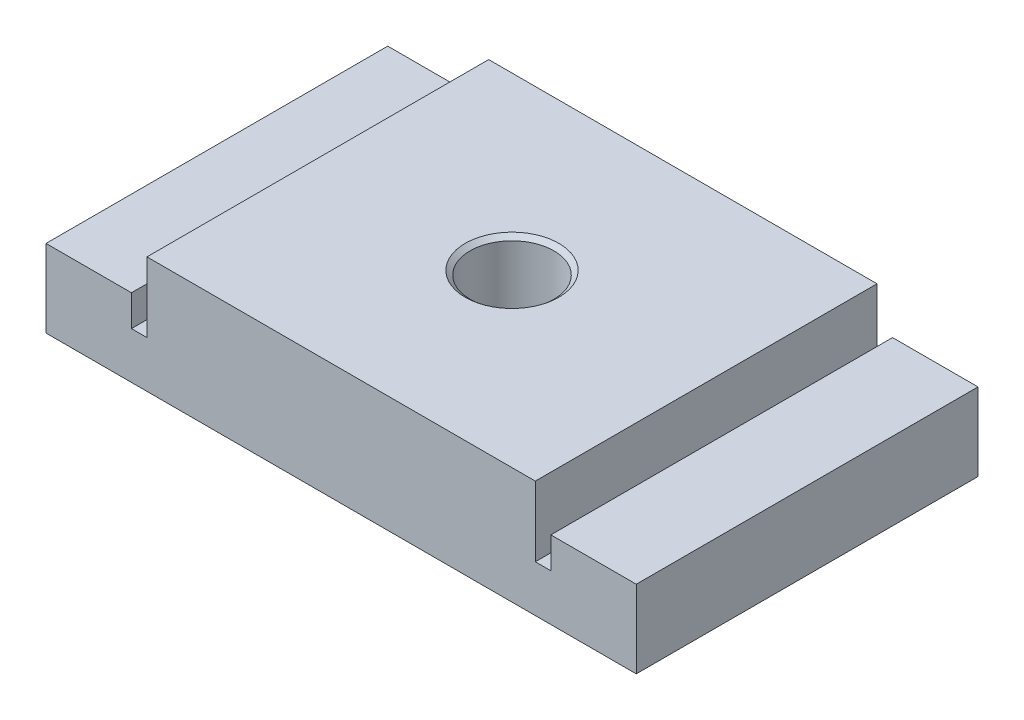
ISO-10303-21;
HEADER;
FILE_DESCRIPTION(('STEP AP214'),'2;1');
FILE_NAME('part.step','',(''),(''),'','','');
FILE_SCHEMA(('AUTOMOTIVE_DESIGN { 1 0 10303 214 1 1 1 1 }'));
ENDSEC;
DATA;
#1=APPLICATION_CONTEXT('core data for automotive mechanical design processes');
#2=APPLICATION_PROTOCOL_DEFINITION('international standard','automotive_design',2000,#1);
#3=PRODUCT_CONTEXT('',#1,'mechanical');
#4=PRODUCT('Part','Part','',(#3));
#5=PRODUCT_RELATED_PRODUCT_CATEGORY('part','',(#4));
#6=PRODUCT_DEFINITION_FORMATION('','',#4);
#7=PRODUCT_DEFINITION_CONTEXT('part definition',#1,'design');
#8=PRODUCT_DEFINITION('design','',#6,#7);
#9=PRODUCT_DEFINITION_SHAPE('','',#8);
#10=(LENGTH_UNIT() NAMED_UNIT(*) SI_UNIT(.MILLI.,.METRE.));
#11=(NAMED_UNIT(*) PLANE_ANGLE_UNIT() SI_UNIT($,.RADIAN.));
#12=(NAMED_UNIT(*) SI_UNIT($,.STERADIAN.) SOLID_ANGLE_UNIT());
#13=UNCERTAINTY_MEASURE_WITH_UNIT(LENGTH_MEASURE(1.E-05),#10,'distance_accuracy_value','');
#14=(GEOMETRIC_REPRESENTATION_CONTEXT(3) GLOBAL_UNCERTAINTY_ASSIGNED_CONTEXT((#13)) GLOBAL_UNIT_ASSIGNED_CONTEXT((#10,
#11,#12)) REPRESENTATION_CONTEXT('',''));
#15=CARTESIAN_POINT('',(0.,0.,0.));
#16=DIRECTION('',(0.,0.,1.));
#17=DIRECTION('',(1.,0.,0.));
#18=AXIS2_PLACEMENT_3D('',#15,#16,#17);
#19=CARTESIAN_POINT('',(-25.,15.,22.));
#20=DIRECTION('',(0.,-1.,0.));
#21=DIRECTION('',(0.,0.,-1.));
#22=AXIS2_PLACEMENT_3D('',#19,#20,#21);
#23=PLANE('',#22);
#24=DIRECTION('',(-1.,0.,0.));
#25=VECTOR('',#24,1.);
#26=CARTESIAN_POINT('',(-25.,15.,-22.));
#27=LINE('',#26,#25);
#28=CARTESIAN_POINT('',(25.,15.,-22.));
#29=VERTEX_POINT('',#28);
#30=CARTESIAN_POINT('',(-25.,15.,-22.));
#31=VERTEX_POINT('',#30);
#32=EDGE_CURVE('E179',#29,#31,#27,.T.);
#33=ORIENTED_EDGE('',*,*,#32,.T.);
#34=DIRECTION('',(0.,0.,-1.));
#35=VECTOR('',#34,1.);
#36=CARTESIAN_POINT('',(-25.,15.,22.));
#37=LINE('',#36,#35);
#38=CARTESIAN_POINT('',(-25.,15.,22.));
#39=VERTEX_POINT('',#38);
#40=EDGE_CURVE('E198',#39,#31,#37,.T.);
#41=ORIENTED_EDGE('',*,*,#40,.F.);
#42=DIRECTION('',(-1.,0.,0.));
#43=VECTOR('',#42,1.);
#44=CARTESIAN_POINT('',(-25.,15.,22.));
#45=LINE('',#44,#43);
#46=CARTESIAN_POINT('',(25.,15.,22.));
#47=VERTEX_POINT('',#46);
#48=EDGE_CURVE('E237',#47,#39,#45,.T.);
#49=ORIENTED_EDGE('',*,*,#48,.F.);
#50=DIRECTION('',(0.,0.,-1.));
#51=VECTOR('',#50,1.);
#52=CARTESIAN_POINT('',(25.,15.,22.));
#53=LINE('',#52,#51);
#54=EDGE_CURVE('E197',#47,#29,#53,.T.);
#55=ORIENTED_EDGE('',*,*,#54,.T.);
#56=EDGE_LOOP('',(#33,#41,#49,#55));
#57=FACE_BOUND('',#56,.T.);
#58=CARTESIAN_POINT('',(0.,15.,0.));
#59=DIRECTION('',(0.,1.,0.));
#60=DIRECTION('',(0.,0.,1.));
#61=AXIS2_PLACEMENT_3D('',#58,#59,#60);
#62=CIRCLE('',#61,6.025);
#63=CARTESIAN_POINT('',(0.,15.,6.025));
#64=VERTEX_POINT('',#63);
#65=EDGE_CURVE('E392',#64,#64,#62,.T.);
#66=ORIENTED_EDGE('',*,*,#65,.F.);
#67=EDGE_LOOP('',(#66));
#68=FACE_BOUND('',#67,.T.);
#69=ADVANCED_FACE('F44',(#57,#68),#23,.F.);
#70=CARTESIAN_POINT('',(-38.,0.,22.));
#71=DIRECTION('',(0.,1.,0.));
#72=DIRECTION('',(0.,0.,1.));
#73=AXIS2_PLACEMENT_3D('',#70,#71,#72);
#74=PLANE('',#73);
#75=CARTESIAN_POINT('',(0.,0.,0.));
#76=DIRECTION('',(0.,1.,0.));
#77=DIRECTION('',(0.,0.,1.));
#78=AXIS2_PLACEMENT_3D('',#75,#76,#77);
#79=CIRCLE('',#78,5.4);
#80=CARTESIAN_POINT('',(0.,0.,5.4));
#81=VERTEX_POINT('',#80);
#82=EDGE_CURVE('E169',#81,#81,#79,.T.);
#83=ORIENTED_EDGE('',*,*,#82,.T.);
#84=EDGE_LOOP('',(#83));
#85=FACE_BOUND('',#84,.T.);
#86=DIRECTION('',(1.,0.,0.));
#87=VECTOR('',#86,1.);
#88=CARTESIAN_POINT('',(-38.,0.,-22.));
#89=LINE('',#88,#87);
#90=CARTESIAN_POINT('',(-38.,0.,-22.));
#91=VERTEX_POINT('',#90);
#92=CARTESIAN_POINT('',(38.,0.,-22.));
#93=VERTEX_POINT('',#92);
#94=EDGE_CURVE('E168',#91,#93,#89,.T.);
#95=ORIENTED_EDGE('',*,*,#94,.T.);
#96=DIRECTION('',(0.,0.,-1.));
#97=VECTOR('',#96,1.);
#98=CARTESIAN_POINT('',(38.,0.,22.));
#99=LINE('',#98,#97);
#100=CARTESIAN_POINT('',(38.,0.,22.));
#101=VERTEX_POINT('',#100);
#102=EDGE_CURVE('E11',#101,#93,#99,.T.);
#103=ORIENTED_EDGE('',*,*,#102,.F.);
#104=DIRECTION('',(1.,0.,0.));
#105=VECTOR('',#104,1.);
#106=CARTESIAN_POINT('',(-38.,0.,22.));
#107=LINE('',#106,#105);
#108=CARTESIAN_POINT('',(-38.,0.,22.));
#109=VERTEX_POINT('',#108);
#110=EDGE_CURVE('E188',#109,#101,#107,.T.);
#111=ORIENTED_EDGE('',*,*,#110,.F.);
#112=DIRECTION('',(0.,0.,-1.));
#113=VECTOR('',#112,1.);
#114=CARTESIAN_POINT('',(-38.,0.,22.));
#115=LINE('',#114,#113);
#116=EDGE_CURVE('E165',#109,#91,#115,.T.);
#117=ORIENTED_EDGE('',*,*,#116,.T.);
#118=EDGE_LOOP('',(#95,#103,#111,#117));
#119=FACE_BOUND('',#118,.T.);
#120=ADVANCED_FACE('F50',(#85,#119),#74,.F.);
#121=CARTESIAN_POINT('',(38.,0.,22.));
#122=DIRECTION('',(-1.,0.,0.));
#123=DIRECTION('',(0.,0.,1.));
#124=AXIS2_PLACEMENT_3D('',#121,#122,#123);
#125=PLANE('',#124);
#126=DIRECTION('',(0.,1.,0.));
#127=VECTOR('',#126,1.);
#128=CARTESIAN_POINT('',(38.,0.,-22.));
#129=LINE('',#128,#127);
#130=CARTESIAN_POINT('',(38.,10.,-22.));
#131=VERTEX_POINT('',#130);
#132=EDGE_CURVE('E170',#93,#131,#129,.T.);
#133=ORIENTED_EDGE('',*,*,#132,.T.);
#134=DIRECTION('',(0.,0.,-1.));
#135=VECTOR('',#134,1.);
#136=CARTESIAN_POINT('',(38.,10.,22.));
#137=LINE('',#136,#135);
#138=CARTESIAN_POINT('',(38.,10.,22.));
#139=VERTEX_POINT('',#138);
#140=EDGE_CURVE('E53',#139,#131,#137,.T.);
#141=ORIENTED_EDGE('',*,*,#140,.F.);
#142=DIRECTION('',(0.,1.,0.));
#143=VECTOR('',#142,1.);
#144=CARTESIAN_POINT('',(38.,0.,22.));
#145=LINE('',#144,#143);
#146=EDGE_CURVE('E120',#101,#139,#145,.T.);
#147=ORIENTED_EDGE('',*,*,#146,.F.);
#148=ORIENTED_EDGE('',*,*,#102,.T.);
#149=EDGE_LOOP('',(#133,#141,#147,#148));
#150=FACE_BOUND('',#149,.T.);
#151=ADVANCED_FACE('F273',(#150),#125,.F.);
#152=CARTESIAN_POINT('',(38.,10.,22.));
#153=DIRECTION('',(0.,-1.,0.));
#154=DIRECTION('',(0.,0.,-1.));
#155=AXIS2_PLACEMENT_3D('',#152,#153,#154);
#156=PLANE('',#155);
#157=DIRECTION('',(-1.,0.,0.));
#158=VECTOR('',#157,1.);
#159=CARTESIAN_POINT('',(38.,10.,-22.));
#160=LINE('',#159,#158);
#161=CARTESIAN_POINT('',(27.,10.,-22.));
#162=VERTEX_POINT('',#161);
#163=EDGE_CURVE('E175',#131,#162,#160,.T.);
#164=ORIENTED_EDGE('',*,*,#163,.T.);
#165=DIRECTION('',(0.,0.,-1.));
#166=VECTOR('',#165,1.);
#167=CARTESIAN_POINT('',(27.,10.,22.));
#168=LINE('',#167,#166);
#169=CARTESIAN_POINT('',(27.,10.,22.));
#170=VERTEX_POINT('',#169);
#171=EDGE_CURVE('E206',#170,#162,#168,.T.);
#172=ORIENTED_EDGE('',*,*,#171,.F.);
#173=DIRECTION('',(-1.,0.,0.));
#174=VECTOR('',#173,1.);
#175=CARTESIAN_POINT('',(38.,10.,22.));
#176=LINE('',#175,#174);
#177=EDGE_CURVE('E218',#139,#170,#176,.T.);
#178=ORIENTED_EDGE('',*,*,#177,.F.);
#179=ORIENTED_EDGE('',*,*,#140,.T.);
#180=EDGE_LOOP('',(#164,#172,#178,#179));
#181=FACE_BOUND('',#180,.T.);
#182=ADVANCED_FACE('F215',(#181),#156,.F.);
#183=CARTESIAN_POINT('',(27.,10.,22.));
#184=DIRECTION('',(1.,0.,0.));
#185=DIRECTION('',(0.,0.,-1.));
#186=AXIS2_PLACEMENT_3D('',#183,#184,#185);
#187=PLANE('',#186);
#188=DIRECTION('',(0.,-1.,0.));
#189=VECTOR('',#188,1.);
#190=CARTESIAN_POINT('',(27.,10.,-22.));
#191=LINE('',#190,#189);
#192=CARTESIAN_POINT('',(27.,6.,-22.));
#193=VERTEX_POINT('',#192);
#194=EDGE_CURVE('E174',#162,#193,#191,.T.);
#195=ORIENTED_EDGE('',*,*,#194,.T.);
#196=DIRECTION('',(0.,0.,-1.));
#197=VECTOR('',#196,1.);
#198=CARTESIAN_POINT('',(27.,6.,22.));
#199=LINE('',#198,#197);
#200=CARTESIAN_POINT('',(27.,6.,22.));
#201=VERTEX_POINT('',#200);
#202=EDGE_CURVE('E203',#201,#193,#199,.T.);
#203=ORIENTED_EDGE('',*,*,#202,.F.);
#204=DIRECTION('',(0.,-1.,0.));
#205=VECTOR('',#204,1.);
#206=CARTESIAN_POINT('',(27.,10.,22.));
#207=LINE('',#206,#205);
#208=EDGE_CURVE('E233',#170,#201,#207,.T.);
#209=ORIENTED_EDGE('',*,*,#208,.F.);
#210=ORIENTED_EDGE('',*,*,#171,.T.);
#211=EDGE_LOOP('',(#195,#203,#209,#210));
#212=FACE_BOUND('',#211,.T.);
#213=ADVANCED_FACE('F224',(#212),#187,.F.);
#214=CARTESIAN_POINT('',(27.,6.,22.));
#215=DIRECTION('',(0.,-1.,0.));
#216=DIRECTION('',(0.,0.,-1.));
#217=AXIS2_PLACEMENT_3D('',#214,#215,#216);
#218=PLANE('',#217);
#219=DIRECTION('',(-1.,0.,0.));
#220=VECTOR('',#219,1.);
#221=CARTESIAN_POINT('',(27.,6.,-22.));
#222=LINE('',#221,#220);
#223=CARTESIAN_POINT('',(25.,6.,-22.));
#224=VERTEX_POINT('',#223);
#225=EDGE_CURVE('E176',#193,#224,#222,.T.);
#226=ORIENTED_EDGE('',*,*,#225,.T.);
#227=DIRECTION('',(0.,0.,-1.));
#228=VECTOR('',#227,1.);
#229=CARTESIAN_POINT('',(25.,6.,22.));
#230=LINE('',#229,#228);
#231=CARTESIAN_POINT('',(25.,6.,22.));
#232=VERTEX_POINT('',#231);
#233=EDGE_CURVE('E205',#232,#224,#230,.T.);
#234=ORIENTED_EDGE('',*,*,#233,.F.);
#235=DIRECTION('',(-1.,0.,0.));
#236=VECTOR('',#235,1.);
#237=CARTESIAN_POINT('',(27.,6.,22.));
#238=LINE('',#237,#236);
#239=EDGE_CURVE('E231',#201,#232,#238,.T.);
#240=ORIENTED_EDGE('',*,*,#239,.F.);
#241=ORIENTED_EDGE('',*,*,#202,.T.);
#242=EDGE_LOOP('',(#226,#234,#240,#241));
#243=FACE_BOUND('',#242,.T.);
#244=ADVANCED_FACE('F227',(#243),#218,.F.);
#245=CARTESIAN_POINT('',(25.,6.,22.));
#246=DIRECTION('',(-1.,0.,0.));
#247=DIRECTION('',(0.,0.,1.));
#248=AXIS2_PLACEMENT_3D('',#245,#246,#247);
#249=PLANE('',#248);
#250=DIRECTION('',(0.,1.,0.));
#251=VECTOR('',#250,1.);
#252=CARTESIAN_POINT('',(25.,6.,-22.));
#253=LINE('',#252,#251);
#254=EDGE_CURVE('E178',#224,#29,#253,.T.);
#255=ORIENTED_EDGE('',*,*,#254,.T.);
#256=ORIENTED_EDGE('',*,*,#54,.F.);
#257=DIRECTION('',(0.,1.,0.));
#258=VECTOR('',#257,1.);
#259=CARTESIAN_POINT('',(25.,6.,22.));
#260=LINE('',#259,#258);
#261=EDGE_CURVE('E232',#232,#47,#260,.T.);
#262=ORIENTED_EDGE('',*,*,#261,.F.);
#263=ORIENTED_EDGE('',*,*,#233,.T.);
#264=EDGE_LOOP('',(#255,#256,#262,#263));
#265=FACE_BOUND('',#264,.T.);
#266=ADVANCED_FACE('F278',(#265),#249,.F.);
#267=CARTESIAN_POINT('',(-25.,6.,22.));
#268=DIRECTION('',(1.,0.,0.));
#269=DIRECTION('',(0.,0.,-1.));
#270=AXIS2_PLACEMENT_3D('',#267,#268,#269);
#271=PLANE('',#270);
#272=DIRECTION('',(0.,-1.,0.));
#273=VECTOR('',#272,1.);
#274=CARTESIAN_POINT('',(-25.,6.,-22.));
#275=LINE('',#274,#273);
#276=CARTESIAN_POINT('',(-25.,6.,-22.));
#277=VERTEX_POINT('',#276);
#278=EDGE_CURVE('E185',#31,#277,#275,.T.);
#279=ORIENTED_EDGE('',*,*,#278,.T.);
#280=DIRECTION('',(0.,0.,-1.));
#281=VECTOR('',#280,1.);
#282=CARTESIAN_POINT('',(-25.,6.,22.));
#283=LINE('',#282,#281);
#284=CARTESIAN_POINT('',(-25.,6.,22.));
#285=VERTEX_POINT('',#284);
#286=EDGE_CURVE('E194',#285,#277,#283,.T.);
#287=ORIENTED_EDGE('',*,*,#286,.F.);
#288=DIRECTION('',(0.,-1.,0.));
#289=VECTOR('',#288,1.);
#290=CARTESIAN_POINT('',(-25.,6.,22.));
#291=LINE('',#290,#289);
#292=EDGE_CURVE('E245',#39,#285,#291,.T.);
#293=ORIENTED_EDGE('',*,*,#292,.F.);
#294=ORIENTED_EDGE('',*,*,#40,.T.);
#295=EDGE_LOOP('',(#279,#287,#293,#294));
#296=FACE_BOUND('',#295,.T.);
#297=ADVANCED_FACE('F246',(#296),#271,.F.);
#298=CARTESIAN_POINT('',(-27.,6.,22.));
#299=DIRECTION('',(0.,-1.,0.));
#300=DIRECTION('',(0.,0.,-1.));
#301=AXIS2_PLACEMENT_3D('',#298,#299,#300);
#302=PLANE('',#301);
#303=DIRECTION('',(-1.,0.,0.));
#304=VECTOR('',#303,1.);
#305=CARTESIAN_POINT('',(-27.,6.,-22.));
#306=LINE('',#305,#304);
#307=CARTESIAN_POINT('',(-27.,6.,-22.));
#308=VERTEX_POINT('',#307);
#309=EDGE_CURVE('E182',#277,#308,#306,.T.);
#310=ORIENTED_EDGE('',*,*,#309,.T.);
#311=DIRECTION('',(0.,0.,-1.));
#312=VECTOR('',#311,1.);
#313=CARTESIAN_POINT('',(-27.,6.,22.));
#314=LINE('',#313,#312);
#315=CARTESIAN_POINT('',(-27.,6.,22.));
#316=VERTEX_POINT('',#315);
#317=EDGE_CURVE('E160',#316,#308,#314,.T.);
#318=ORIENTED_EDGE('',*,*,#317,.F.);
#319=DIRECTION('',(-1.,0.,0.));
#320=VECTOR('',#319,1.);
#321=CARTESIAN_POINT('',(-27.,6.,22.));
#322=LINE('',#321,#320);
#323=EDGE_CURVE('E149',#285,#316,#322,.T.);
#324=ORIENTED_EDGE('',*,*,#323,.F.);
#325=ORIENTED_EDGE('',*,*,#286,.T.);
#326=EDGE_LOOP('',(#310,#318,#324,#325));
#327=FACE_BOUND('',#326,.T.);
#328=ADVANCED_FACE('F255',(#327),#302,.F.);
#329=CARTESIAN_POINT('',(-27.,10.,22.));
#330=DIRECTION('',(-1.,0.,0.));
#331=DIRECTION('',(0.,0.,1.));
#332=AXIS2_PLACEMENT_3D('',#329,#330,#331);
#333=PLANE('',#332);
#334=DIRECTION('',(0.,1.,0.));
#335=VECTOR('',#334,1.);
#336=CARTESIAN_POINT('',(-27.,10.,-22.));
#337=LINE('',#336,#335);
#338=CARTESIAN_POINT('',(-27.,10.,-22.));
#339=VERTEX_POINT('',#338);
#340=EDGE_CURVE('E157',#308,#339,#337,.T.);
#341=ORIENTED_EDGE('',*,*,#340,.T.);
#342=DIRECTION('',(0.,0.,-1.));
#343=VECTOR('',#342,1.);
#344=CARTESIAN_POINT('',(-27.,10.,22.));
#345=LINE('',#344,#343);
#346=CARTESIAN_POINT('',(-27.,10.,22.));
#347=VERTEX_POINT('',#346);
#348=EDGE_CURVE('E151',#347,#339,#345,.T.);
#349=ORIENTED_EDGE('',*,*,#348,.F.);
#350=DIRECTION('',(0.,1.,0.));
#351=VECTOR('',#350,1.);
#352=CARTESIAN_POINT('',(-27.,10.,22.));
#353=LINE('',#352,#351);
#354=EDGE_CURVE('E145',#316,#347,#353,.T.);
#355=ORIENTED_EDGE('',*,*,#354,.F.);
#356=ORIENTED_EDGE('',*,*,#317,.T.);
#357=EDGE_LOOP('',(#341,#349,#355,#356));
#358=FACE_BOUND('',#357,.T.);
#359=ADVANCED_FACE('F152',(#358),#333,.F.);
#360=CARTESIAN_POINT('',(-38.,10.,22.));
#361=DIRECTION('',(0.,-1.,0.));
#362=DIRECTION('',(0.,0.,-1.));
#363=AXIS2_PLACEMENT_3D('',#360,#361,#362);
#364=PLANE('',#363);
#365=DIRECTION('',(-1.,0.,0.));
#366=VECTOR('',#365,1.);
#367=CARTESIAN_POINT('',(-38.,10.,-22.));
#368=LINE('',#367,#366);
#369=CARTESIAN_POINT('',(-38.,10.,-22.));
#370=VERTEX_POINT('',#369);
#371=EDGE_CURVE('E104',#339,#370,#368,.T.);
#372=ORIENTED_EDGE('',*,*,#371,.T.);
#373=DIRECTION('',(0.,0.,-1.));
#374=VECTOR('',#373,1.);
#375=CARTESIAN_POINT('',(-38.,10.,22.));
#376=LINE('',#375,#374);
#377=CARTESIAN_POINT('',(-38.,10.,22.));
#378=VERTEX_POINT('',#377);
#379=EDGE_CURVE('E156',#378,#370,#376,.T.);
#380=ORIENTED_EDGE('',*,*,#379,.F.);
#381=DIRECTION('',(-1.,0.,0.));
#382=VECTOR('',#381,1.);
#383=CARTESIAN_POINT('',(-38.,10.,22.));
#384=LINE('',#383,#382);
#385=EDGE_CURVE('E147',#347,#378,#384,.T.);
#386=ORIENTED_EDGE('',*,*,#385,.F.);
#387=ORIENTED_EDGE('',*,*,#348,.T.);
#388=EDGE_LOOP('',(#372,#380,#386,#387));
#389=FACE_BOUND('',#388,.T.);
#390=ADVANCED_FACE('F158',(#389),#364,.F.);
#391=CARTESIAN_POINT('',(-38.,0.,22.));
#392=DIRECTION('',(1.,0.,0.));
#393=DIRECTION('',(0.,0.,-1.));
#394=AXIS2_PLACEMENT_3D('',#391,#392,#393);
#395=PLANE('',#394);
#396=DIRECTION('',(0.,-1.,0.));
#397=VECTOR('',#396,1.);
#398=CARTESIAN_POINT('',(-38.,0.,-22.));
#399=LINE('',#398,#397);
#400=EDGE_CURVE('E107',#370,#91,#399,.T.);
#401=ORIENTED_EDGE('',*,*,#400,.T.);
#402=ORIENTED_EDGE('',*,*,#116,.F.);
#403=DIRECTION('',(0.,-1.,0.));
#404=VECTOR('',#403,1.);
#405=CARTESIAN_POINT('',(-38.,0.,22.));
#406=LINE('',#405,#404);
#407=EDGE_CURVE('E65',#378,#109,#406,.T.);
#408=ORIENTED_EDGE('',*,*,#407,.F.);
#409=ORIENTED_EDGE('',*,*,#379,.T.);
#410=EDGE_LOOP('',(#401,#402,#408,#409));
#411=FACE_BOUND('',#410,.T.);
#412=ADVANCED_FACE('F258',(#411),#395,.F.);
#413=CARTESIAN_POINT('',(0.,0.,22.));
#414=DIRECTION('',(0.,0.,1.));
#415=DIRECTION('',(1.,0.,0.));
#416=AXIS2_PLACEMENT_3D('',#413,#414,#415);
#417=PLANE('',#416);
#418=ORIENTED_EDGE('',*,*,#110,.T.);
#419=ORIENTED_EDGE('',*,*,#146,.T.);
#420=ORIENTED_EDGE('',*,*,#177,.T.);
#421=ORIENTED_EDGE('',*,*,#208,.T.);
#422=ORIENTED_EDGE('',*,*,#239,.T.);
#423=ORIENTED_EDGE('',*,*,#261,.T.);
#424=ORIENTED_EDGE('',*,*,#48,.T.);
#425=ORIENTED_EDGE('',*,*,#292,.T.);
#426=ORIENTED_EDGE('',*,*,#323,.T.);
#427=ORIENTED_EDGE('',*,*,#354,.T.);
#428=ORIENTED_EDGE('',*,*,#385,.T.);
#429=ORIENTED_EDGE('',*,*,#407,.T.);
#430=EDGE_LOOP('',(#418,#419,#420,#421,#422,#423,#424,#425,#426,#427,#428,#429));
#431=FACE_BOUND('',#430,.T.);
#432=ADVANCED_FACE('F143',(#431),#417,.T.);
#433=CARTESIAN_POINT('',(0.,0.,-22.));
#434=DIRECTION('',(0.,0.,1.));
#435=DIRECTION('',(1.,0.,0.));
#436=AXIS2_PLACEMENT_3D('',#433,#434,#435);
#437=PLANE('',#436);
#438=ORIENTED_EDGE('',*,*,#94,.F.);
#439=ORIENTED_EDGE('',*,*,#400,.F.);
#440=ORIENTED_EDGE('',*,*,#371,.F.);
#441=ORIENTED_EDGE('',*,*,#340,.F.);
#442=ORIENTED_EDGE('',*,*,#309,.F.);
#443=ORIENTED_EDGE('',*,*,#278,.F.);
#444=ORIENTED_EDGE('',*,*,#32,.F.);
#445=ORIENTED_EDGE('',*,*,#254,.F.);
#446=ORIENTED_EDGE('',*,*,#225,.F.);
#447=ORIENTED_EDGE('',*,*,#194,.F.);
#448=ORIENTED_EDGE('',*,*,#163,.F.);
#449=ORIENTED_EDGE('',*,*,#132,.F.);
#450=EDGE_LOOP('',(#438,#439,#440,#441,#442,#443,#444,#445,#446,#447,#448,#449));
#451=FACE_BOUND('',#450,.T.);
#452=ADVANCED_FACE('F217',(#451),#437,.F.);
#453=CARTESIAN_POINT('',(0.,15.,0.));
#454=DIRECTION('',(0.,1.,0.));
#455=DIRECTION('',(0.,0.,1.));
#456=AXIS2_PLACEMENT_3D('',#453,#454,#455);
#457=CYLINDRICAL_SURFACE('',#456,5.4);
#458=ORIENTED_EDGE('',*,*,#82,.F.);
#459=EDGE_LOOP('',(#458));
#460=FACE_BOUND('',#459,.T.);
#461=CARTESIAN_POINT('',(0.,14.4755627305142,0.));
#462=DIRECTION('',(0.,1.,0.));
#463=DIRECTION('',(0.,0.,1.));
#464=AXIS2_PLACEMENT_3D('',#461,#462,#463);
#465=CIRCLE('',#464,5.4);
#466=CARTESIAN_POINT('',(0.,14.4755627305142,5.4));
#467=VERTEX_POINT('',#466);
#468=EDGE_CURVE('E387',#467,#467,#465,.T.);
#469=ORIENTED_EDGE('',*,*,#468,.T.);
#470=EDGE_LOOP('',(#469));
#471=FACE_BOUND('',#470,.T.);
#472=ADVANCED_FACE('F352',(#460,#471),#457,.F.);
#473=CARTESIAN_POINT('',(0.,15.,0.));
#474=DIRECTION('',(0.,1.,0.));
#475=DIRECTION('',(0.,0.,1.));
#476=AXIS2_PLACEMENT_3D('',#473,#474,#475);
#477=CONICAL_SURFACE('',#476,6.025,0.872664625997164);
#478=ORIENTED_EDGE('',*,*,#468,.F.);
#479=EDGE_LOOP('',(#478));
#480=FACE_BOUND('',#479,.T.);
#481=ORIENTED_EDGE('',*,*,#65,.T.);
#482=EDGE_LOOP('',(#481));
#483=FACE_BOUND('',#482,.T.);
#484=ADVANCED_FACE('F367',(#480,#483),#477,.F.);
#485=CLOSED_SHELL('',(#69,#120,#151,#182,#213,#244,#266,#297,#328,#359,#390,#412,#432,#452,#472,#484));
#486=MANIFOLD_SOLID_BREP('B2',#485);
#487=ADVANCED_BREP_SHAPE_REPRESENTATION('',(#18,#486),#14);
#488=SHAPE_DEFINITION_REPRESENTATION(#9,#487);
ENDSEC;
END-ISO-10303-21;
